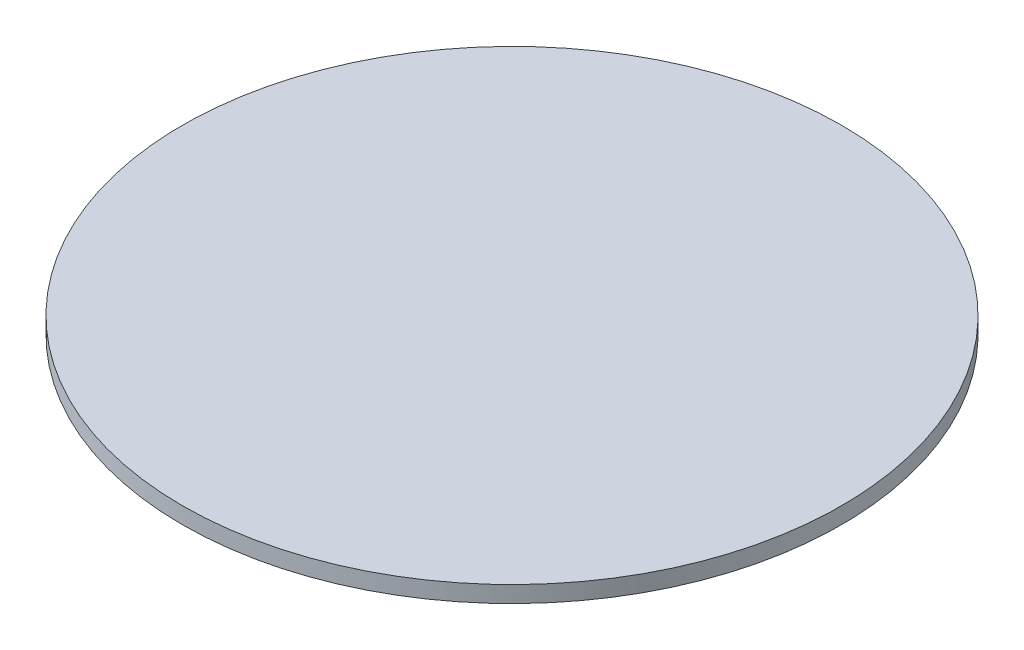
ISO-10303-21;
HEADER;
FILE_DESCRIPTION(('STEP AP214'),'2;1');
FILE_NAME('part.step','',(''),(''),'','','');
FILE_SCHEMA(('AUTOMOTIVE_DESIGN { 1 0 10303 214 1 1 1 1 }'));
ENDSEC;
DATA;
#1=APPLICATION_CONTEXT('core data for automotive mechanical design processes');
#2=APPLICATION_PROTOCOL_DEFINITION('international standard','automotive_design',2000,#1);
#3=PRODUCT_CONTEXT('',#1,'mechanical');
#4=PRODUCT('Part','Part','',(#3));
#5=PRODUCT_RELATED_PRODUCT_CATEGORY('part','',(#4));
#6=PRODUCT_DEFINITION_FORMATION('','',#4);
#7=PRODUCT_DEFINITION_CONTEXT('part definition',#1,'design');
#8=PRODUCT_DEFINITION('design','',#6,#7);
#9=PRODUCT_DEFINITION_SHAPE('','',#8);
#10=(LENGTH_UNIT() NAMED_UNIT(*) SI_UNIT(.MILLI.,.METRE.));
#11=(NAMED_UNIT(*) PLANE_ANGLE_UNIT() SI_UNIT($,.RADIAN.));
#12=(NAMED_UNIT(*) SI_UNIT($,.STERADIAN.) SOLID_ANGLE_UNIT());
#13=UNCERTAINTY_MEASURE_WITH_UNIT(LENGTH_MEASURE(1.E-05),#10,'distance_accuracy_value','');
#14=(GEOMETRIC_REPRESENTATION_CONTEXT(3) GLOBAL_UNCERTAINTY_ASSIGNED_CONTEXT((#13)) GLOBAL_UNIT_ASSIGNED_CONTEXT((#10,
#11,#12)) REPRESENTATION_CONTEXT('',''));
#15=CARTESIAN_POINT('',(0.,0.,0.));
#16=DIRECTION('',(0.,0.,1.));
#17=DIRECTION('',(1.,0.,0.));
#18=AXIS2_PLACEMENT_3D('',#15,#16,#17);
#19=CARTESIAN_POINT('',(0.,2.5,0.));
#20=DIRECTION('',(0.,-1.,0.));
#21=DIRECTION('',(0.,0.,-1.));
#22=AXIS2_PLACEMENT_3D('',#19,#20,#21);
#23=CYLINDRICAL_SURFACE('',#22,50.);
#24=CARTESIAN_POINT('',(0.,2.5,0.));
#25=DIRECTION('',(0.,1.,0.));
#26=DIRECTION('',(0.,0.,1.));
#27=AXIS2_PLACEMENT_3D('',#24,#25,#26);
#28=CIRCLE('',#27,50.);
#29=CARTESIAN_POINT('',(0.,2.5,50.));
#30=VERTEX_POINT('',#29);
#31=EDGE_CURVE('E10',#30,#30,#28,.T.);
#32=ORIENTED_EDGE('',*,*,#31,.F.);
#33=EDGE_LOOP('',(#32));
#34=FACE_BOUND('',#33,.T.);
#35=CARTESIAN_POINT('',(0.,0.,0.));
#36=DIRECTION('',(0.,1.,0.));
#37=DIRECTION('',(0.,0.,1.));
#38=AXIS2_PLACEMENT_3D('',#35,#36,#37);
#39=CIRCLE('',#38,50.);
#40=CARTESIAN_POINT('',(0.,0.,50.));
#41=VERTEX_POINT('',#40);
#42=EDGE_CURVE('E38',#41,#41,#39,.T.);
#43=ORIENTED_EDGE('',*,*,#42,.T.);
#44=EDGE_LOOP('',(#43));
#45=FACE_BOUND('',#44,.T.);
#46=ADVANCED_FACE('F35',(#34,#45),#23,.T.);
#47=CARTESIAN_POINT('',(0.,2.5,0.));
#48=DIRECTION('',(0.,1.,0.));
#49=DIRECTION('',(0.,0.,1.));
#50=AXIS2_PLACEMENT_3D('',#47,#48,#49);
#51=PLANE('',#50);
#52=ORIENTED_EDGE('',*,*,#31,.T.);
#53=EDGE_LOOP('',(#52));
#54=FACE_BOUND('',#53,.T.);
#55=ADVANCED_FACE('F50',(#54),#51,.T.);
#56=CARTESIAN_POINT('',(0.,0.,0.));
#57=DIRECTION('',(0.,1.,0.));
#58=DIRECTION('',(0.,0.,1.));
#59=AXIS2_PLACEMENT_3D('',#56,#57,#58);
#60=PLANE('',#59);
#61=ORIENTED_EDGE('',*,*,#42,.F.);
#62=EDGE_LOOP('',(#61));
#63=FACE_BOUND('',#62,.T.);
#64=ADVANCED_FACE('F48',(#63),#60,.F.);
#65=CLOSED_SHELL('',(#46,#55,#64));
#66=MANIFOLD_SOLID_BREP('B2',#65);
#67=ADVANCED_BREP_SHAPE_REPRESENTATION('',(#18,#66),#14);
#68=SHAPE_DEFINITION_REPRESENTATION(#9,#67);
ENDSEC;
END-ISO-10303-21;
